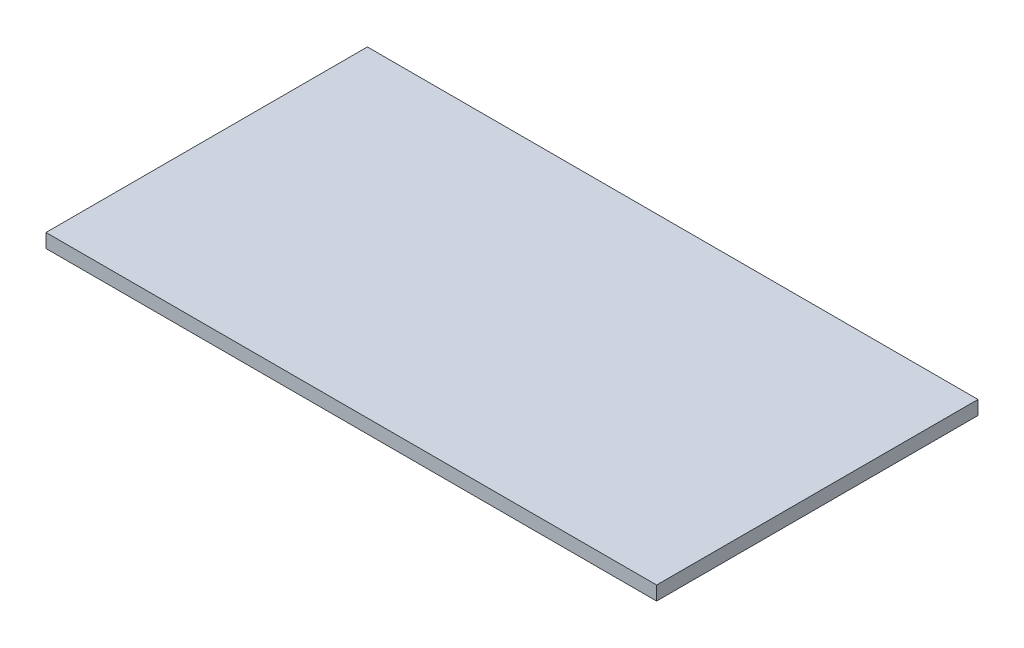
ISO-10303-21;
HEADER;
FILE_DESCRIPTION(('STEP AP214'),'2;1');
FILE_NAME('part.step','',(''),(''),'','','');
FILE_SCHEMA(('AUTOMOTIVE_DESIGN { 1 0 10303 214 1 1 1 1 }'));
ENDSEC;
DATA;
#1=APPLICATION_CONTEXT('core data for automotive mechanical design processes');
#2=APPLICATION_PROTOCOL_DEFINITION('international standard','automotive_design',2000,#1);
#3=PRODUCT_CONTEXT('',#1,'mechanical');
#4=PRODUCT('Part','Part','',(#3));
#5=PRODUCT_RELATED_PRODUCT_CATEGORY('part','',(#4));
#6=PRODUCT_DEFINITION_FORMATION('','',#4);
#7=PRODUCT_DEFINITION_CONTEXT('part definition',#1,'design');
#8=PRODUCT_DEFINITION('design','',#6,#7);
#9=PRODUCT_DEFINITION_SHAPE('','',#8);
#10=(LENGTH_UNIT() NAMED_UNIT(*) SI_UNIT(.MILLI.,.METRE.));
#11=(NAMED_UNIT(*) PLANE_ANGLE_UNIT() SI_UNIT($,.RADIAN.));
#12=(NAMED_UNIT(*) SI_UNIT($,.STERADIAN.) SOLID_ANGLE_UNIT());
#13=UNCERTAINTY_MEASURE_WITH_UNIT(LENGTH_MEASURE(1.E-05),#10,'distance_accuracy_value','');
#14=(GEOMETRIC_REPRESENTATION_CONTEXT(3) GLOBAL_UNCERTAINTY_ASSIGNED_CONTEXT((#13)) GLOBAL_UNIT_ASSIGNED_CONTEXT((#10,
#11,#12)) REPRESENTATION_CONTEXT('',''));
#15=CARTESIAN_POINT('',(0.,0.,0.));
#16=DIRECTION('',(0.,0.,1.));
#17=DIRECTION('',(1.,0.,0.));
#18=AXIS2_PLACEMENT_3D('',#15,#16,#17);
#19=CARTESIAN_POINT('',(57.,2.6,-30.));
#20=DIRECTION('',(-1.,0.,0.));
#21=DIRECTION('',(0.,0.,1.));
#22=AXIS2_PLACEMENT_3D('',#19,#20,#21);
#23=PLANE('',#22);
#24=DIRECTION('',(0.,0.,-1.));
#25=VECTOR('',#24,1.);
#26=CARTESIAN_POINT('',(57.,0.,-30.));
#27=LINE('',#26,#25);
#28=CARTESIAN_POINT('',(57.,0.,30.));
#29=VERTEX_POINT('',#28);
#30=CARTESIAN_POINT('',(57.,0.,-30.));
#31=VERTEX_POINT('',#30);
#32=EDGE_CURVE('E102',#29,#31,#27,.T.);
#33=ORIENTED_EDGE('',*,*,#32,.T.);
#34=DIRECTION('',(0.,-1.,0.));
#35=VECTOR('',#34,1.);
#36=CARTESIAN_POINT('',(57.,2.6,-30.));
#37=LINE('',#36,#35);
#38=CARTESIAN_POINT('',(57.,2.6,-30.));
#39=VERTEX_POINT('',#38);
#40=EDGE_CURVE('E11',#39,#31,#37,.T.);
#41=ORIENTED_EDGE('',*,*,#40,.F.);
#42=DIRECTION('',(0.,0.,-1.));
#43=VECTOR('',#42,1.);
#44=CARTESIAN_POINT('',(57.,2.6,-30.));
#45=LINE('',#44,#43);
#46=CARTESIAN_POINT('',(57.,2.6,30.));
#47=VERTEX_POINT('',#46);
#48=EDGE_CURVE('E90',#47,#39,#45,.T.);
#49=ORIENTED_EDGE('',*,*,#48,.F.);
#50=DIRECTION('',(0.,-1.,0.));
#51=VECTOR('',#50,1.);
#52=CARTESIAN_POINT('',(57.,2.6,30.));
#53=LINE('',#52,#51);
#54=EDGE_CURVE('E98',#47,#29,#53,.T.);
#55=ORIENTED_EDGE('',*,*,#54,.T.);
#56=EDGE_LOOP('',(#33,#41,#49,#55));
#57=FACE_BOUND('',#56,.T.);
#58=ADVANCED_FACE('F39',(#57),#23,.F.);
#59=CARTESIAN_POINT('',(-57.,2.6,-30.));
#60=DIRECTION('',(0.,0.,1.));
#61=DIRECTION('',(1.,0.,0.));
#62=AXIS2_PLACEMENT_3D('',#59,#60,#61);
#63=PLANE('',#62);
#64=DIRECTION('',(-1.,0.,0.));
#65=VECTOR('',#64,1.);
#66=CARTESIAN_POINT('',(-57.,0.,-30.));
#67=LINE('',#66,#65);
#68=CARTESIAN_POINT('',(-57.,0.,-30.));
#69=VERTEX_POINT('',#68);
#70=EDGE_CURVE('E94',#31,#69,#67,.T.);
#71=ORIENTED_EDGE('',*,*,#70,.T.);
#72=DIRECTION('',(0.,-1.,0.));
#73=VECTOR('',#72,1.);
#74=CARTESIAN_POINT('',(-57.,2.6,-30.));
#75=LINE('',#74,#73);
#76=CARTESIAN_POINT('',(-57.,2.6,-30.));
#77=VERTEX_POINT('',#76);
#78=EDGE_CURVE('E47',#77,#69,#75,.T.);
#79=ORIENTED_EDGE('',*,*,#78,.F.);
#80=DIRECTION('',(-1.,0.,0.));
#81=VECTOR('',#80,1.);
#82=CARTESIAN_POINT('',(-57.,2.6,-30.));
#83=LINE('',#82,#81);
#84=EDGE_CURVE('E85',#39,#77,#83,.T.);
#85=ORIENTED_EDGE('',*,*,#84,.F.);
#86=ORIENTED_EDGE('',*,*,#40,.T.);
#87=EDGE_LOOP('',(#71,#79,#85,#86));
#88=FACE_BOUND('',#87,.T.);
#89=ADVANCED_FACE('F93',(#88),#63,.F.);
#90=CARTESIAN_POINT('',(-57.,2.6,-30.));
#91=DIRECTION('',(1.,0.,0.));
#92=DIRECTION('',(0.,0.,-1.));
#93=AXIS2_PLACEMENT_3D('',#90,#91,#92);
#94=PLANE('',#93);
#95=DIRECTION('',(0.,0.,1.));
#96=VECTOR('',#95,1.);
#97=CARTESIAN_POINT('',(-57.,0.,-30.));
#98=LINE('',#97,#96);
#99=CARTESIAN_POINT('',(-57.,0.,30.));
#100=VERTEX_POINT('',#99);
#101=EDGE_CURVE('E72',#69,#100,#98,.T.);
#102=ORIENTED_EDGE('',*,*,#101,.T.);
#103=DIRECTION('',(0.,-1.,0.));
#104=VECTOR('',#103,1.);
#105=CARTESIAN_POINT('',(-57.,2.6,30.));
#106=LINE('',#105,#104);
#107=CARTESIAN_POINT('',(-57.,2.6,30.));
#108=VERTEX_POINT('',#107);
#109=EDGE_CURVE('E95',#108,#100,#106,.T.);
#110=ORIENTED_EDGE('',*,*,#109,.F.);
#111=DIRECTION('',(0.,0.,1.));
#112=VECTOR('',#111,1.);
#113=CARTESIAN_POINT('',(-57.,2.6,-30.));
#114=LINE('',#113,#112);
#115=EDGE_CURVE('E88',#77,#108,#114,.T.);
#116=ORIENTED_EDGE('',*,*,#115,.F.);
#117=ORIENTED_EDGE('',*,*,#78,.T.);
#118=EDGE_LOOP('',(#102,#110,#116,#117));
#119=FACE_BOUND('',#118,.T.);
#120=ADVANCED_FACE('F96',(#119),#94,.F.);
#121=CARTESIAN_POINT('',(-57.,2.6,30.));
#122=DIRECTION('',(0.,0.,-1.));
#123=DIRECTION('',(-1.,0.,0.));
#124=AXIS2_PLACEMENT_3D('',#121,#122,#123);
#125=PLANE('',#124);
#126=DIRECTION('',(1.,0.,0.));
#127=VECTOR('',#126,1.);
#128=CARTESIAN_POINT('',(-57.,0.,30.));
#129=LINE('',#128,#127);
#130=EDGE_CURVE('E78',#100,#29,#129,.T.);
#131=ORIENTED_EDGE('',*,*,#130,.T.);
#132=ORIENTED_EDGE('',*,*,#54,.F.);
#133=DIRECTION('',(1.,0.,0.));
#134=VECTOR('',#133,1.);
#135=CARTESIAN_POINT('',(-57.,2.6,30.));
#136=LINE('',#135,#134);
#137=EDGE_CURVE('E55',#108,#47,#136,.T.);
#138=ORIENTED_EDGE('',*,*,#137,.F.);
#139=ORIENTED_EDGE('',*,*,#109,.T.);
#140=EDGE_LOOP('',(#131,#132,#138,#139));
#141=FACE_BOUND('',#140,.T.);
#142=ADVANCED_FACE('F109',(#141),#125,.F.);
#143=CARTESIAN_POINT('',(0.,2.6,0.));
#144=DIRECTION('',(0.,1.,0.));
#145=DIRECTION('',(0.,0.,1.));
#146=AXIS2_PLACEMENT_3D('',#143,#144,#145);
#147=PLANE('',#146);
#148=ORIENTED_EDGE('',*,*,#48,.T.);
#149=ORIENTED_EDGE('',*,*,#84,.T.);
#150=ORIENTED_EDGE('',*,*,#115,.T.);
#151=ORIENTED_EDGE('',*,*,#137,.T.);
#152=EDGE_LOOP('',(#148,#149,#150,#151));
#153=FACE_BOUND('',#152,.T.);
#154=ADVANCED_FACE('F86',(#153),#147,.T.);
#155=CARTESIAN_POINT('',(0.,0.,0.));
#156=DIRECTION('',(0.,1.,0.));
#157=DIRECTION('',(0.,0.,1.));
#158=AXIS2_PLACEMENT_3D('',#155,#156,#157);
#159=PLANE('',#158);
#160=ORIENTED_EDGE('',*,*,#32,.F.);
#161=ORIENTED_EDGE('',*,*,#130,.F.);
#162=ORIENTED_EDGE('',*,*,#101,.F.);
#163=ORIENTED_EDGE('',*,*,#70,.F.);
#164=EDGE_LOOP('',(#160,#161,#162,#163));
#165=FACE_BOUND('',#164,.T.);
#166=ADVANCED_FACE('F112',(#165),#159,.F.);
#167=CLOSED_SHELL('',(#58,#89,#120,#142,#154,#166));
#168=MANIFOLD_SOLID_BREP('B2',#167);
#169=ADVANCED_BREP_SHAPE_REPRESENTATION('',(#18,#168),#14);
#170=SHAPE_DEFINITION_REPRESENTATION(#9,#169);
ENDSEC;
END-ISO-10303-21;
